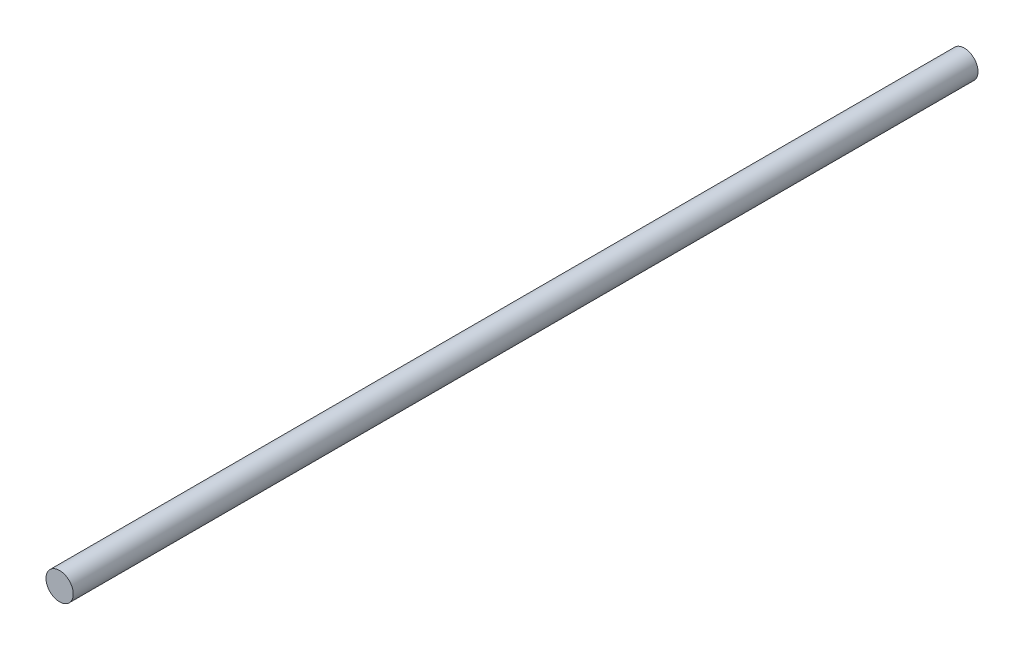
ISO-10303-21;
HEADER;
FILE_DESCRIPTION(('STEP AP214'),'2;1');
FILE_NAME('part.step','',(''),(''),'','','');
FILE_SCHEMA(('AUTOMOTIVE_DESIGN { 1 0 10303 214 1 1 1 1 }'));
ENDSEC;
DATA;
#1=APPLICATION_CONTEXT('core data for automotive mechanical design processes');
#2=APPLICATION_PROTOCOL_DEFINITION('international standard','automotive_design',2000,#1);
#3=PRODUCT_CONTEXT('',#1,'mechanical');
#4=PRODUCT('Part','Part','',(#3));
#5=PRODUCT_RELATED_PRODUCT_CATEGORY('part','',(#4));
#6=PRODUCT_DEFINITION_FORMATION('','',#4);
#7=PRODUCT_DEFINITION_CONTEXT('part definition',#1,'design');
#8=PRODUCT_DEFINITION('design','',#6,#7);
#9=PRODUCT_DEFINITION_SHAPE('','',#8);
#10=(LENGTH_UNIT() NAMED_UNIT(*) SI_UNIT(.MILLI.,.METRE.));
#11=(NAMED_UNIT(*) PLANE_ANGLE_UNIT() SI_UNIT($,.RADIAN.));
#12=(NAMED_UNIT(*) SI_UNIT($,.STERADIAN.) SOLID_ANGLE_UNIT());
#13=UNCERTAINTY_MEASURE_WITH_UNIT(LENGTH_MEASURE(1.E-05),#10,'distance_accuracy_value','');
#14=(GEOMETRIC_REPRESENTATION_CONTEXT(3) GLOBAL_UNCERTAINTY_ASSIGNED_CONTEXT((#13)) GLOBAL_UNIT_ASSIGNED_CONTEXT((#10,
#11,#12)) REPRESENTATION_CONTEXT('',''));
#15=CARTESIAN_POINT('',(0.,0.,0.));
#16=DIRECTION('',(0.,0.,1.));
#17=DIRECTION('',(1.,0.,0.));
#18=AXIS2_PLACEMENT_3D('',#15,#16,#17);
#19=CARTESIAN_POINT('',(0.,0.,431.8));
#20=DIRECTION('',(0.,0.,-1.));
#21=DIRECTION('',(-1.,0.,0.));
#22=AXIS2_PLACEMENT_3D('',#19,#20,#21);
#23=CYLINDRICAL_SURFACE('',#22,6.5);
#24=CARTESIAN_POINT('',(0.,0.,431.8));
#25=DIRECTION('',(0.,0.,1.));
#26=DIRECTION('',(1.,0.,0.));
#27=AXIS2_PLACEMENT_3D('',#24,#25,#26);
#28=CIRCLE('',#27,6.5);
#29=CARTESIAN_POINT('',(6.5,0.,431.8));
#30=VERTEX_POINT('',#29);
#31=EDGE_CURVE('E10',#30,#30,#28,.T.);
#32=ORIENTED_EDGE('',*,*,#31,.F.);
#33=EDGE_LOOP('',(#32));
#34=FACE_BOUND('',#33,.T.);
#35=CARTESIAN_POINT('',(0.,0.,0.));
#36=DIRECTION('',(0.,0.,1.));
#37=DIRECTION('',(1.,0.,0.));
#38=AXIS2_PLACEMENT_3D('',#35,#36,#37);
#39=CIRCLE('',#38,6.5);
#40=CARTESIAN_POINT('',(6.5,0.,0.));
#41=VERTEX_POINT('',#40);
#42=EDGE_CURVE('E33',#41,#41,#39,.T.);
#43=ORIENTED_EDGE('',*,*,#42,.T.);
#44=EDGE_LOOP('',(#43));
#45=FACE_BOUND('',#44,.T.);
#46=ADVANCED_FACE('F30',(#34,#45),#23,.T.);
#47=CARTESIAN_POINT('',(0.,0.,431.8));
#48=DIRECTION('',(0.,0.,1.));
#49=DIRECTION('',(1.,0.,0.));
#50=AXIS2_PLACEMENT_3D('',#47,#48,#49);
#51=PLANE('',#50);
#52=ORIENTED_EDGE('',*,*,#31,.T.);
#53=EDGE_LOOP('',(#52));
#54=FACE_BOUND('',#53,.T.);
#55=ADVANCED_FACE('F45',(#54),#51,.T.);
#56=CARTESIAN_POINT('',(0.,0.,0.));
#57=DIRECTION('',(0.,0.,1.));
#58=DIRECTION('',(1.,0.,0.));
#59=AXIS2_PLACEMENT_3D('',#56,#57,#58);
#60=PLANE('',#59);
#61=ORIENTED_EDGE('',*,*,#42,.F.);
#62=EDGE_LOOP('',(#61));
#63=FACE_BOUND('',#62,.T.);
#64=ADVANCED_FACE('F43',(#63),#60,.F.);
#65=CLOSED_SHELL('',(#46,#55,#64));
#66=MANIFOLD_SOLID_BREP('B2',#65);
#67=ADVANCED_BREP_SHAPE_REPRESENTATION('',(#18,#66),#14);
#68=SHAPE_DEFINITION_REPRESENTATION(#9,#67);
ENDSEC;
END-ISO-10303-21;
